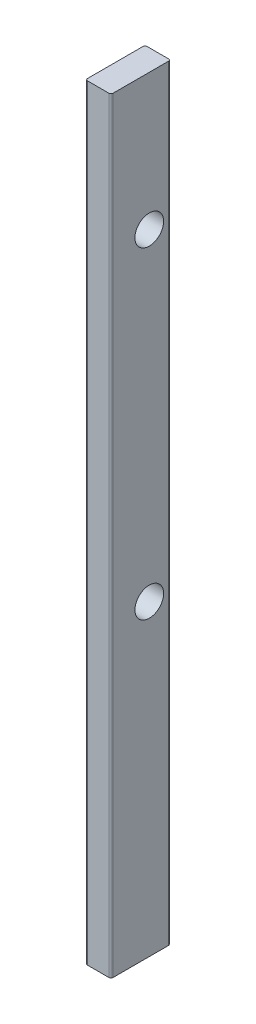
ISO-10303-21;
HEADER;
FILE_DESCRIPTION(('STEP AP214'),'2;1');
FILE_NAME('part.step','',(''),(''),'','','');
FILE_SCHEMA(('AUTOMOTIVE_DESIGN { 1 0 10303 214 1 1 1 1 }'));
ENDSEC;
DATA;
#1=APPLICATION_CONTEXT('core data for automotive mechanical design processes');
#2=APPLICATION_PROTOCOL_DEFINITION('international standard','automotive_design',2000,#1);
#3=PRODUCT_CONTEXT('',#1,'mechanical');
#4=PRODUCT('Part','Part','',(#3));
#5=PRODUCT_RELATED_PRODUCT_CATEGORY('part','',(#4));
#6=PRODUCT_DEFINITION_FORMATION('','',#4);
#7=PRODUCT_DEFINITION_CONTEXT('part definition',#1,'design');
#8=PRODUCT_DEFINITION('design','',#6,#7);
#9=PRODUCT_DEFINITION_SHAPE('','',#8);
#10=(LENGTH_UNIT() NAMED_UNIT(*) SI_UNIT(.MILLI.,.METRE.));
#11=(NAMED_UNIT(*) PLANE_ANGLE_UNIT() SI_UNIT($,.RADIAN.));
#12=(NAMED_UNIT(*) SI_UNIT($,.STERADIAN.) SOLID_ANGLE_UNIT());
#13=UNCERTAINTY_MEASURE_WITH_UNIT(LENGTH_MEASURE(1.E-05),#10,'distance_accuracy_value','');
#14=(GEOMETRIC_REPRESENTATION_CONTEXT(3) GLOBAL_UNCERTAINTY_ASSIGNED_CONTEXT((#13)) GLOBAL_UNIT_ASSIGNED_CONTEXT((#10,
#11,#12)) REPRESENTATION_CONTEXT('',''));
#15=CARTESIAN_POINT('',(0.,0.,0.));
#16=DIRECTION('',(0.,0.,1.));
#17=DIRECTION('',(1.,0.,0.));
#18=AXIS2_PLACEMENT_3D('',#15,#16,#17);
#19=CARTESIAN_POINT('',(19.05,1143.,44.45));
#20=DIRECTION('',(-1.,0.,0.));
#21=DIRECTION('',(0.,0.,1.));
#22=AXIS2_PLACEMENT_3D('',#19,#20,#21);
#23=PLANE('',#22);
#24=CARTESIAN_POINT('',(19.05,458.7875,-12.7));
#25=DIRECTION('',(1.,0.,0.));
#26=DIRECTION('',(0.,0.,-1.));
#27=AXIS2_PLACEMENT_3D('',#24,#25,#26);
#28=CIRCLE('',#27,21.43125);
#29=CARTESIAN_POINT('',(19.05,458.7875,8.73125));
#30=VERTEX_POINT('',#29);
#31=EDGE_CURVE('E125',#30,#30,#28,.T.);
#32=ORIENTED_EDGE('',*,*,#31,.F.);
#33=EDGE_LOOP('',(#32));
#34=FACE_BOUND('',#33,.T.);
#35=CARTESIAN_POINT('',(19.05,939.8,-12.7));
#36=DIRECTION('',(1.,0.,0.));
#37=DIRECTION('',(0.,0.,-1.));
#38=AXIS2_PLACEMENT_3D('',#35,#36,#37);
#39=CIRCLE('',#38,21.43125);
#40=CARTESIAN_POINT('',(19.05,939.8,8.73125));
#41=VERTEX_POINT('',#40);
#42=EDGE_CURVE('E181',#41,#41,#39,.T.);
#43=ORIENTED_EDGE('',*,*,#42,.F.);
#44=EDGE_LOOP('',(#43));
#45=FACE_BOUND('',#44,.T.);
#46=DIRECTION('',(0.,0.,-1.));
#47=VECTOR('',#46,1.);
#48=CARTESIAN_POINT('',(19.05,1143.,44.45));
#49=LINE('',#48,#47);
#50=CARTESIAN_POINT('',(19.05,1143.,41.275));
#51=VERTEX_POINT('',#50);
#52=CARTESIAN_POINT('',(19.05,1143.,-41.275));
#53=VERTEX_POINT('',#52);
#54=EDGE_CURVE('E118',#51,#53,#49,.T.);
#55=ORIENTED_EDGE('',*,*,#54,.F.);
#56=DIRECTION('',(0.,-1.,0.));
#57=VECTOR('',#56,1.);
#58=CARTESIAN_POINT('',(19.05,1143.,41.275));
#59=LINE('',#58,#57);
#60=CARTESIAN_POINT('',(19.05,0.,41.275));
#61=VERTEX_POINT('',#60);
#62=EDGE_CURVE('E103',#51,#61,#59,.T.);
#63=ORIENTED_EDGE('',*,*,#62,.T.);
#64=DIRECTION('',(0.,0.,-1.));
#65=VECTOR('',#64,1.);
#66=CARTESIAN_POINT('',(19.05,0.,44.45));
#67=LINE('',#66,#65);
#68=CARTESIAN_POINT('',(19.05,0.,-41.275));
#69=VERTEX_POINT('',#68);
#70=EDGE_CURVE('E115',#61,#69,#67,.T.);
#71=ORIENTED_EDGE('',*,*,#70,.T.);
#72=DIRECTION('',(0.,-1.,0.));
#73=VECTOR('',#72,1.);
#74=CARTESIAN_POINT('',(19.05,1143.,-41.275));
#75=LINE('',#74,#73);
#76=EDGE_CURVE('E120',#69,#53,#75,.F.);
#77=ORIENTED_EDGE('',*,*,#76,.T.);
#78=EDGE_LOOP('',(#55,#63,#71,#77));
#79=FACE_BOUND('',#78,.T.);
#80=ADVANCED_FACE('F33',(#34,#45,#79),#23,.F.);
#81=CARTESIAN_POINT('',(-19.05,1143.,-44.45));
#82=DIRECTION('',(0.,0.,1.));
#83=DIRECTION('',(1.,0.,0.));
#84=AXIS2_PLACEMENT_3D('',#81,#82,#83);
#85=PLANE('',#84);
#86=DIRECTION('',(-1.,0.,0.));
#87=VECTOR('',#86,1.);
#88=CARTESIAN_POINT('',(-19.05,0.,-44.45));
#89=LINE('',#88,#87);
#90=CARTESIAN_POINT('',(15.875,0.,-44.45));
#91=VERTEX_POINT('',#90);
#92=CARTESIAN_POINT('',(-15.875,0.,-44.45));
#93=VERTEX_POINT('',#92);
#94=EDGE_CURVE('E124',#91,#93,#89,.T.);
#95=ORIENTED_EDGE('',*,*,#94,.T.);
#96=DIRECTION('',(0.,-1.,0.));
#97=VECTOR('',#96,1.);
#98=CARTESIAN_POINT('',(-15.875,1143.,-44.45));
#99=LINE('',#98,#97);
#100=CARTESIAN_POINT('',(-15.875,1143.,-44.45));
#101=VERTEX_POINT('',#100);
#102=EDGE_CURVE('E11',#93,#101,#99,.F.);
#103=ORIENTED_EDGE('',*,*,#102,.T.);
#104=DIRECTION('',(-1.,0.,0.));
#105=VECTOR('',#104,1.);
#106=CARTESIAN_POINT('',(-19.05,1143.,-44.45));
#107=LINE('',#106,#105);
#108=CARTESIAN_POINT('',(15.875,1143.,-44.45));
#109=VERTEX_POINT('',#108);
#110=EDGE_CURVE('E164',#109,#101,#107,.T.);
#111=ORIENTED_EDGE('',*,*,#110,.F.);
#112=DIRECTION('',(0.,-1.,0.));
#113=VECTOR('',#112,1.);
#114=CARTESIAN_POINT('',(15.875,1143.,-44.45));
#115=LINE('',#114,#113);
#116=EDGE_CURVE('E41',#109,#91,#115,.T.);
#117=ORIENTED_EDGE('',*,*,#116,.T.);
#118=EDGE_LOOP('',(#95,#103,#111,#117));
#119=FACE_BOUND('',#118,.T.);
#120=ADVANCED_FACE('F162',(#119),#85,.F.);
#121=CARTESIAN_POINT('',(-19.05,1143.,44.45));
#122=DIRECTION('',(1.,0.,0.));
#123=DIRECTION('',(0.,0.,-1.));
#124=AXIS2_PLACEMENT_3D('',#121,#122,#123);
#125=PLANE('',#124);
#126=CARTESIAN_POINT('',(-19.05,458.7875,-12.7));
#127=DIRECTION('',(1.,0.,0.));
#128=DIRECTION('',(0.,0.,-1.));
#129=AXIS2_PLACEMENT_3D('',#126,#127,#128);
#130=CIRCLE('',#129,21.43125);
#131=CARTESIAN_POINT('',(-19.05,458.7875,8.73125));
#132=VERTEX_POINT('',#131);
#133=EDGE_CURVE('E131',#132,#132,#130,.T.);
#134=ORIENTED_EDGE('',*,*,#133,.T.);
#135=EDGE_LOOP('',(#134));
#136=FACE_BOUND('',#135,.T.);
#137=CARTESIAN_POINT('',(-19.05,939.8,-12.7));
#138=DIRECTION('',(1.,0.,0.));
#139=DIRECTION('',(0.,0.,-1.));
#140=AXIS2_PLACEMENT_3D('',#137,#138,#139);
#141=CIRCLE('',#140,21.43125);
#142=CARTESIAN_POINT('',(-19.05,939.8,8.73125));
#143=VERTEX_POINT('',#142);
#144=EDGE_CURVE('E178',#143,#143,#141,.T.);
#145=ORIENTED_EDGE('',*,*,#144,.T.);
#146=EDGE_LOOP('',(#145));
#147=FACE_BOUND('',#146,.T.);
#148=DIRECTION('',(0.,0.,1.));
#149=VECTOR('',#148,1.);
#150=CARTESIAN_POINT('',(-19.05,0.,44.45));
#151=LINE('',#150,#149);
#152=CARTESIAN_POINT('',(-19.05,0.,-41.275));
#153=VERTEX_POINT('',#152);
#154=CARTESIAN_POINT('',(-19.05,0.,41.275));
#155=VERTEX_POINT('',#154);
#156=EDGE_CURVE('E128',#153,#155,#151,.T.);
#157=ORIENTED_EDGE('',*,*,#156,.T.);
#158=DIRECTION('',(0.,-1.,0.));
#159=VECTOR('',#158,1.);
#160=CARTESIAN_POINT('',(-19.05,1143.,41.275));
#161=LINE('',#160,#159);
#162=CARTESIAN_POINT('',(-19.05,1143.,41.275));
#163=VERTEX_POINT('',#162);
#164=EDGE_CURVE('E48',#155,#163,#161,.F.);
#165=ORIENTED_EDGE('',*,*,#164,.T.);
#166=DIRECTION('',(0.,0.,1.));
#167=VECTOR('',#166,1.);
#168=CARTESIAN_POINT('',(-19.05,1143.,44.45));
#169=LINE('',#168,#167);
#170=CARTESIAN_POINT('',(-19.05,1143.,-41.275));
#171=VERTEX_POINT('',#170);
#172=EDGE_CURVE('E172',#171,#163,#169,.T.);
#173=ORIENTED_EDGE('',*,*,#172,.F.);
#174=DIRECTION('',(0.,-1.,0.));
#175=VECTOR('',#174,1.);
#176=CARTESIAN_POINT('',(-19.05,1143.,-41.275));
#177=LINE('',#176,#175);
#178=EDGE_CURVE('E155',#171,#153,#177,.T.);
#179=ORIENTED_EDGE('',*,*,#178,.T.);
#180=EDGE_LOOP('',(#157,#165,#173,#179));
#181=FACE_BOUND('',#180,.T.);
#182=ADVANCED_FACE('F171',(#136,#147,#181),#125,.F.);
#183=CARTESIAN_POINT('',(-19.05,1143.,44.45));
#184=DIRECTION('',(0.,0.,-1.));
#185=DIRECTION('',(-1.,0.,0.));
#186=AXIS2_PLACEMENT_3D('',#183,#184,#185);
#187=PLANE('',#186);
#188=DIRECTION('',(1.,0.,0.));
#189=VECTOR('',#188,1.);
#190=CARTESIAN_POINT('',(-19.05,0.,44.45));
#191=LINE('',#190,#189);
#192=CARTESIAN_POINT('',(-15.875,0.,44.45));
#193=VERTEX_POINT('',#192);
#194=CARTESIAN_POINT('',(15.875,0.,44.45));
#195=VERTEX_POINT('',#194);
#196=EDGE_CURVE('E138',#193,#195,#191,.T.);
#197=ORIENTED_EDGE('',*,*,#196,.T.);
#198=DIRECTION('',(0.,-1.,0.));
#199=VECTOR('',#198,1.);
#200=CARTESIAN_POINT('',(15.875,1143.,44.45));
#201=LINE('',#200,#199);
#202=CARTESIAN_POINT('',(15.875,1143.,44.45));
#203=VERTEX_POINT('',#202);
#204=EDGE_CURVE('E104',#195,#203,#201,.F.);
#205=ORIENTED_EDGE('',*,*,#204,.T.);
#206=DIRECTION('',(1.,0.,0.));
#207=VECTOR('',#206,1.);
#208=CARTESIAN_POINT('',(-19.05,1143.,44.45));
#209=LINE('',#208,#207);
#210=CARTESIAN_POINT('',(-15.875,1143.,44.45));
#211=VERTEX_POINT('',#210);
#212=EDGE_CURVE('E134',#211,#203,#209,.T.);
#213=ORIENTED_EDGE('',*,*,#212,.F.);
#214=DIRECTION('',(0.,-1.,0.));
#215=VECTOR('',#214,1.);
#216=CARTESIAN_POINT('',(-15.875,1143.,44.45));
#217=LINE('',#216,#215);
#218=EDGE_CURVE('E109',#211,#193,#217,.T.);
#219=ORIENTED_EDGE('',*,*,#218,.T.);
#220=EDGE_LOOP('',(#197,#205,#213,#219));
#221=FACE_BOUND('',#220,.T.);
#222=ADVANCED_FACE('F225',(#221),#187,.F.);
#223=CARTESIAN_POINT('',(0.,1143.,0.));
#224=DIRECTION('',(0.,-1.,0.));
#225=DIRECTION('',(0.,0.,-1.));
#226=AXIS2_PLACEMENT_3D('',#223,#224,#225);
#227=PLANE('',#226);
#228=ORIENTED_EDGE('',*,*,#212,.T.);
#229=CARTESIAN_POINT('',(15.875,1143.,41.275));
#230=DIRECTION('',(0.,-1.,0.));
#231=DIRECTION('',(0.,0.,-1.));
#232=AXIS2_PLACEMENT_3D('',#229,#230,#231);
#233=CIRCLE('',#232,3.175);
#234=EDGE_CURVE('E153',#203,#51,#233,.F.);
#235=ORIENTED_EDGE('',*,*,#234,.T.);
#236=ORIENTED_EDGE('',*,*,#54,.T.);
#237=CARTESIAN_POINT('',(15.875,1143.,-41.275));
#238=DIRECTION('',(0.,-1.,0.));
#239=DIRECTION('',(0.,0.,-1.));
#240=AXIS2_PLACEMENT_3D('',#237,#238,#239);
#241=CIRCLE('',#240,3.175);
#242=EDGE_CURVE('E148',#53,#109,#241,.F.);
#243=ORIENTED_EDGE('',*,*,#242,.T.);
#244=ORIENTED_EDGE('',*,*,#110,.T.);
#245=CARTESIAN_POINT('',(-15.875,1143.,-41.275));
#246=DIRECTION('',(0.,-1.,0.));
#247=DIRECTION('',(0.,0.,-1.));
#248=AXIS2_PLACEMENT_3D('',#245,#246,#247);
#249=CIRCLE('',#248,3.175);
#250=EDGE_CURVE('E55',#101,#171,#249,.F.);
#251=ORIENTED_EDGE('',*,*,#250,.T.);
#252=ORIENTED_EDGE('',*,*,#172,.T.);
#253=CARTESIAN_POINT('',(-15.875,1143.,41.275));
#254=DIRECTION('',(0.,-1.,0.));
#255=DIRECTION('',(0.,0.,-1.));
#256=AXIS2_PLACEMENT_3D('',#253,#254,#255);
#257=CIRCLE('',#256,3.175);
#258=EDGE_CURVE('E151',#163,#211,#257,.F.);
#259=ORIENTED_EDGE('',*,*,#258,.T.);
#260=EDGE_LOOP('',(#228,#235,#236,#243,#244,#251,#252,#259));
#261=FACE_BOUND('',#260,.T.);
#262=ADVANCED_FACE('F221',(#261),#227,.F.);
#263=CARTESIAN_POINT('',(0.,0.,0.));
#264=DIRECTION('',(0.,-1.,0.));
#265=DIRECTION('',(0.,0.,-1.));
#266=AXIS2_PLACEMENT_3D('',#263,#264,#265);
#267=PLANE('',#266);
#268=ORIENTED_EDGE('',*,*,#70,.F.);
#269=CARTESIAN_POINT('',(15.875,0.,41.275));
#270=DIRECTION('',(0.,-1.,0.));
#271=DIRECTION('',(0.,0.,-1.));
#272=AXIS2_PLACEMENT_3D('',#269,#270,#271);
#273=CIRCLE('',#272,3.175);
#274=EDGE_CURVE('E99',#61,#195,#273,.T.);
#275=ORIENTED_EDGE('',*,*,#274,.T.);
#276=ORIENTED_EDGE('',*,*,#196,.F.);
#277=CARTESIAN_POINT('',(-15.875,0.,41.275));
#278=DIRECTION('',(0.,-1.,0.));
#279=DIRECTION('',(0.,0.,-1.));
#280=AXIS2_PLACEMENT_3D('',#277,#278,#279);
#281=CIRCLE('',#280,3.175);
#282=EDGE_CURVE('E110',#193,#155,#281,.T.);
#283=ORIENTED_EDGE('',*,*,#282,.T.);
#284=ORIENTED_EDGE('',*,*,#156,.F.);
#285=CARTESIAN_POINT('',(-15.875,0.,-41.275));
#286=DIRECTION('',(0.,-1.,0.));
#287=DIRECTION('',(0.,0.,-1.));
#288=AXIS2_PLACEMENT_3D('',#285,#286,#287);
#289=CIRCLE('',#288,3.175);
#290=EDGE_CURVE('E142',#153,#93,#289,.T.);
#291=ORIENTED_EDGE('',*,*,#290,.T.);
#292=ORIENTED_EDGE('',*,*,#94,.F.);
#293=CARTESIAN_POINT('',(15.875,0.,-41.275));
#294=DIRECTION('',(0.,-1.,0.));
#295=DIRECTION('',(0.,0.,-1.));
#296=AXIS2_PLACEMENT_3D('',#293,#294,#295);
#297=CIRCLE('',#296,3.175);
#298=EDGE_CURVE('E119',#91,#69,#297,.T.);
#299=ORIENTED_EDGE('',*,*,#298,.T.);
#300=EDGE_LOOP('',(#268,#275,#276,#283,#284,#291,#292,#299));
#301=FACE_BOUND('',#300,.T.);
#302=ADVANCED_FACE('F122',(#301),#267,.T.);
#303=CARTESIAN_POINT('',(19.05,939.8,-12.7));
#304=DIRECTION('',(-1.,0.,0.));
#305=DIRECTION('',(0.,0.,1.));
#306=AXIS2_PLACEMENT_3D('',#303,#304,#305);
#307=CYLINDRICAL_SURFACE('',#306,21.43125);
#308=CARTESIAN_POINT('',(19.05,939.8,8.73125));
#309=CARTESIAN_POINT('',(18.653125,939.8,8.73125));
#310=CARTESIAN_POINT('',(18.25625,939.8,8.73125));
#311=CARTESIAN_POINT('',(17.4625,939.8,8.73125));
#312=CARTESIAN_POINT('',(17.065625,939.8,8.73125));
#313=CARTESIAN_POINT('',(16.271875,939.8,8.73125));
#314=CARTESIAN_POINT('',(15.875,939.8,8.73125));
#315=CARTESIAN_POINT('',(15.08125,939.8,8.73125));
#316=CARTESIAN_POINT('',(14.684375,939.8,8.73125));
#317=CARTESIAN_POINT('',(13.890625,939.8,8.73125));
#318=CARTESIAN_POINT('',(13.49375,939.8,8.73125));
#319=CARTESIAN_POINT('',(12.7,939.8,8.73125));
#320=CARTESIAN_POINT('',(12.303125,939.8,8.73125));
#321=CARTESIAN_POINT('',(11.509375,939.8,8.73125));
#322=CARTESIAN_POINT('',(11.1125,939.8,8.73125));
#323=CARTESIAN_POINT('',(10.31875,939.8,8.73125));
#324=CARTESIAN_POINT('',(9.921875,939.8,8.73125));
#325=CARTESIAN_POINT('',(9.128125,939.8,8.73125));
#326=CARTESIAN_POINT('',(8.73125,939.8,8.73125));
#327=CARTESIAN_POINT('',(7.9375,939.8,8.73125));
#328=CARTESIAN_POINT('',(7.540625,939.8,8.73125));
#329=CARTESIAN_POINT('',(6.746875,939.8,8.73125));
#330=CARTESIAN_POINT('',(6.35,939.8,8.73125));
#331=CARTESIAN_POINT('',(5.55625,939.8,8.73125));
#332=CARTESIAN_POINT('',(5.159375,939.8,8.73125));
#333=CARTESIAN_POINT('',(4.365625,939.8,8.73125));
#334=CARTESIAN_POINT('',(3.96875,939.8,8.73125));
#335=CARTESIAN_POINT('',(3.175,939.8,8.73125));
#336=CARTESIAN_POINT('',(2.778125,939.8,8.73125));
#337=CARTESIAN_POINT('',(1.984375,939.8,8.73125));
#338=CARTESIAN_POINT('',(1.5875,939.8,8.73125));
#339=CARTESIAN_POINT('',(0.793750000000004,939.8,8.73125));
#340=CARTESIAN_POINT('',(0.396875000000004,939.8,8.73125));
#341=CARTESIAN_POINT('',(-0.396874999999997,939.8,8.73125));
#342=CARTESIAN_POINT('',(-0.793749999999997,939.8,8.73125));
#343=CARTESIAN_POINT('',(-1.5875,939.8,8.73125));
#344=CARTESIAN_POINT('',(-1.984375,939.8,8.73125));
#345=CARTESIAN_POINT('',(-2.778125,939.8,8.73125));
#346=CARTESIAN_POINT('',(-3.175,939.8,8.73125));
#347=CARTESIAN_POINT('',(-3.96875,939.8,8.73125));
#348=CARTESIAN_POINT('',(-4.365625,939.8,8.73125));
#349=CARTESIAN_POINT('',(-5.159375,939.8,8.73125));
#350=CARTESIAN_POINT('',(-5.55625,939.8,8.73125));
#351=CARTESIAN_POINT('',(-6.35,939.8,8.73125));
#352=CARTESIAN_POINT('',(-6.746875,939.8,8.73125));
#353=CARTESIAN_POINT('',(-7.540625,939.8,8.73125));
#354=CARTESIAN_POINT('',(-7.9375,939.8,8.73125));
#355=CARTESIAN_POINT('',(-8.73125,939.8,8.73125));
#356=CARTESIAN_POINT('',(-9.128125,939.8,8.73125));
#357=CARTESIAN_POINT('',(-9.921875,939.8,8.73125));
#358=CARTESIAN_POINT('',(-10.31875,939.8,8.73125));
#359=CARTESIAN_POINT('',(-11.1125,939.8,8.73125));
#360=CARTESIAN_POINT('',(-11.509375,939.8,8.73125));
#361=CARTESIAN_POINT('',(-12.303125,939.8,8.73125));
#362=CARTESIAN_POINT('',(-12.7,939.8,8.73125));
#363=CARTESIAN_POINT('',(-13.49375,939.8,8.73125));
#364=CARTESIAN_POINT('',(-13.890625,939.8,8.73125));
#365=CARTESIAN_POINT('',(-14.684375,939.8,8.73125));
#366=CARTESIAN_POINT('',(-15.08125,939.8,8.73125));
#367=CARTESIAN_POINT('',(-15.875,939.8,8.73125));
#368=CARTESIAN_POINT('',(-16.271875,939.8,8.73125));
#369=CARTESIAN_POINT('',(-17.065625,939.8,8.73125));
#370=CARTESIAN_POINT('',(-17.4625,939.8,8.73125));
#371=CARTESIAN_POINT('',(-18.25625,939.8,8.73125));
#372=CARTESIAN_POINT('',(-18.653125,939.8,8.73125));
#373=CARTESIAN_POINT('',(-19.05,939.8,8.73125));
#374=B_SPLINE_CURVE_WITH_KNOTS('',3,(#308,#309,#310,#311,#312,#313,#314,#315,#316,#317,#318,
#319,#320,#321,#322,#323,#324,#325,#326,#327,#328,#329,#330,#331,#332,#333,#334,#335,#336,#337,
#338,#339,#340,#341,#342,#343,#344,#345,#346,#347,#348,#349,#350,#351,#352,#353,#354,#355,#356,
#357,#358,#359,#360,#361,#362,#363,#364,#365,#366,#367,#368,#369,#370,#371,#372,#373),
.UNSPECIFIED.,.F.,.F.,(4,2,2,2,2,2,2,2,2,2,2,2,2,2,2,2,2,2,2,2,2,2,2,2,2,2,2,2,2,2,2,2,4),(0.,
1.190625,2.38125,3.571875,4.7625,5.953125,7.14375,8.334375,9.525,10.715625,11.90625,13.096875,
14.2875,15.478125,16.66875,17.859375,19.05,20.240625,21.43125,22.621875,23.8125,25.003125,
26.19375,27.384375,28.575,29.765625,30.95625,32.146875,33.3375,34.528125,35.71875,36.909375,
38.1),.UNSPECIFIED.);
#375=EDGE_CURVE('BSEAM191',#41,#143,#374,.T.);
#376=ORIENTED_EDGE('',*,*,#42,.T.);
#377=ORIENTED_EDGE('',*,*,#144,.F.);
#378=ORIENTED_EDGE('',*,*,#375,.T.);
#379=ORIENTED_EDGE('',*,*,#375,.F.);
#380=EDGE_LOOP('',(#376,#378,#377,#379));
#381=FACE_BOUND('',#380,.T.);
#382=ADVANCED_FACE('F191',(#381),#307,.F.);
#383=CARTESIAN_POINT('',(19.05,458.7875,-12.7));
#384=DIRECTION('',(-1.,0.,0.));
#385=DIRECTION('',(0.,0.,1.));
#386=AXIS2_PLACEMENT_3D('',#383,#384,#385);
#387=CYLINDRICAL_SURFACE('',#386,21.43125);
#388=CARTESIAN_POINT('',(19.05,458.7875,8.73125));
#389=CARTESIAN_POINT('',(18.653125,458.7875,8.73125));
#390=CARTESIAN_POINT('',(18.25625,458.7875,8.73125));
#391=CARTESIAN_POINT('',(17.4625,458.7875,8.73125));
#392=CARTESIAN_POINT('',(17.065625,458.7875,8.73125));
#393=CARTESIAN_POINT('',(16.271875,458.7875,8.73125));
#394=CARTESIAN_POINT('',(15.875,458.7875,8.73125));
#395=CARTESIAN_POINT('',(15.08125,458.7875,8.73125));
#396=CARTESIAN_POINT('',(14.684375,458.7875,8.73125));
#397=CARTESIAN_POINT('',(13.890625,458.7875,8.73125));
#398=CARTESIAN_POINT('',(13.49375,458.7875,8.73125));
#399=CARTESIAN_POINT('',(12.7,458.7875,8.73125));
#400=CARTESIAN_POINT('',(12.303125,458.7875,8.73125));
#401=CARTESIAN_POINT('',(11.509375,458.7875,8.73125));
#402=CARTESIAN_POINT('',(11.1125,458.7875,8.73125));
#403=CARTESIAN_POINT('',(10.31875,458.7875,8.73125));
#404=CARTESIAN_POINT('',(9.921875,458.7875,8.73125));
#405=CARTESIAN_POINT('',(9.128125,458.7875,8.73125));
#406=CARTESIAN_POINT('',(8.73125,458.7875,8.73125));
#407=CARTESIAN_POINT('',(7.9375,458.7875,8.73125));
#408=CARTESIAN_POINT('',(7.540625,458.7875,8.73125));
#409=CARTESIAN_POINT('',(6.746875,458.7875,8.73125));
#410=CARTESIAN_POINT('',(6.35,458.7875,8.73125));
#411=CARTESIAN_POINT('',(5.55625,458.7875,8.73125));
#412=CARTESIAN_POINT('',(5.159375,458.7875,8.73125));
#413=CARTESIAN_POINT('',(4.365625,458.7875,8.73125));
#414=CARTESIAN_POINT('',(3.96875,458.7875,8.73125));
#415=CARTESIAN_POINT('',(3.175,458.7875,8.73125));
#416=CARTESIAN_POINT('',(2.778125,458.7875,8.73125));
#417=CARTESIAN_POINT('',(1.984375,458.7875,8.73125));
#418=CARTESIAN_POINT('',(1.5875,458.7875,8.73125));
#419=CARTESIAN_POINT('',(0.793750000000004,458.7875,8.73125));
#420=CARTESIAN_POINT('',(0.396875000000004,458.7875,8.73125));
#421=CARTESIAN_POINT('',(-0.396874999999997,458.7875,8.73125));
#422=CARTESIAN_POINT('',(-0.793749999999997,458.7875,8.73125));
#423=CARTESIAN_POINT('',(-1.5875,458.7875,8.73125));
#424=CARTESIAN_POINT('',(-1.984375,458.7875,8.73125));
#425=CARTESIAN_POINT('',(-2.778125,458.7875,8.73125));
#426=CARTESIAN_POINT('',(-3.175,458.7875,8.73125));
#427=CARTESIAN_POINT('',(-3.96875,458.7875,8.73125));
#428=CARTESIAN_POINT('',(-4.365625,458.7875,8.73125));
#429=CARTESIAN_POINT('',(-5.159375,458.7875,8.73125));
#430=CARTESIAN_POINT('',(-5.55625,458.7875,8.73125));
#431=CARTESIAN_POINT('',(-6.35,458.7875,8.73125));
#432=CARTESIAN_POINT('',(-6.746875,458.7875,8.73125));
#433=CARTESIAN_POINT('',(-7.540625,458.7875,8.73125));
#434=CARTESIAN_POINT('',(-7.9375,458.7875,8.73125));
#435=CARTESIAN_POINT('',(-8.73125,458.7875,8.73125));
#436=CARTESIAN_POINT('',(-9.128125,458.7875,8.73125));
#437=CARTESIAN_POINT('',(-9.921875,458.7875,8.73125));
#438=CARTESIAN_POINT('',(-10.31875,458.7875,8.73125));
#439=CARTESIAN_POINT('',(-11.1125,458.7875,8.73125));
#440=CARTESIAN_POINT('',(-11.509375,458.7875,8.73125));
#441=CARTESIAN_POINT('',(-12.303125,458.7875,8.73125));
#442=CARTESIAN_POINT('',(-12.7,458.7875,8.73125));
#443=CARTESIAN_POINT('',(-13.49375,458.7875,8.73125));
#444=CARTESIAN_POINT('',(-13.890625,458.7875,8.73125));
#445=CARTESIAN_POINT('',(-14.684375,458.7875,8.73125));
#446=CARTESIAN_POINT('',(-15.08125,458.7875,8.73125));
#447=CARTESIAN_POINT('',(-15.875,458.7875,8.73125));
#448=CARTESIAN_POINT('',(-16.271875,458.7875,8.73125));
#449=CARTESIAN_POINT('',(-17.065625,458.7875,8.73125));
#450=CARTESIAN_POINT('',(-17.4625,458.7875,8.73125));
#451=CARTESIAN_POINT('',(-18.25625,458.7875,8.73125));
#452=CARTESIAN_POINT('',(-18.653125,458.7875,8.73125));
#453=CARTESIAN_POINT('',(-19.05,458.7875,8.73125));
#454=B_SPLINE_CURVE_WITH_KNOTS('',3,(#388,#389,#390,#391,#392,#393,#394,#395,#396,#397,#398,
#399,#400,#401,#402,#403,#404,#405,#406,#407,#408,#409,#410,#411,#412,#413,#414,#415,#416,#417,
#418,#419,#420,#421,#422,#423,#424,#425,#426,#427,#428,#429,#430,#431,#432,#433,#434,#435,#436,
#437,#438,#439,#440,#441,#442,#443,#444,#445,#446,#447,#448,#449,#450,#451,#452,#453),
.UNSPECIFIED.,.F.,.F.,(4,2,2,2,2,2,2,2,2,2,2,2,2,2,2,2,2,2,2,2,2,2,2,2,2,2,2,2,2,2,2,2,4),(0.,
1.190625,2.38125,3.571875,4.7625,5.953125,7.14375,8.334375,9.525,10.715625,11.90625,13.096875,
14.2875,15.478125,16.66875,17.859375,19.05,20.240625,21.43125,22.621875,23.8125,25.003125,
26.19375,27.384375,28.575,29.765625,30.95625,32.146875,33.3375,34.528125,35.71875,36.909375,
38.1),.UNSPECIFIED.);
#455=EDGE_CURVE('BSEAM189',#30,#132,#454,.T.);
#456=ORIENTED_EDGE('',*,*,#31,.T.);
#457=ORIENTED_EDGE('',*,*,#133,.F.);
#458=ORIENTED_EDGE('',*,*,#455,.T.);
#459=ORIENTED_EDGE('',*,*,#455,.F.);
#460=EDGE_LOOP('',(#456,#458,#457,#459));
#461=FACE_BOUND('',#460,.T.);
#462=ADVANCED_FACE('F189',(#461),#387,.F.);
#463=CARTESIAN_POINT('',(15.875,1143.,41.275));
#464=DIRECTION('',(0.,-1.,0.));
#465=DIRECTION('',(0.,0.,-1.));
#466=AXIS2_PLACEMENT_3D('',#463,#464,#465);
#467=CYLINDRICAL_SURFACE('',#466,3.175);
#468=ORIENTED_EDGE('',*,*,#234,.F.);
#469=ORIENTED_EDGE('',*,*,#204,.F.);
#470=ORIENTED_EDGE('',*,*,#274,.F.);
#471=ORIENTED_EDGE('',*,*,#62,.F.);
#472=EDGE_LOOP('',(#468,#469,#470,#471));
#473=FACE_BOUND('',#472,.T.);
#474=ADVANCED_FACE('F102',(#473),#467,.T.);
#475=CARTESIAN_POINT('',(-15.875,1143.,41.275));
#476=DIRECTION('',(0.,-1.,0.));
#477=DIRECTION('',(0.,0.,-1.));
#478=AXIS2_PLACEMENT_3D('',#475,#476,#477);
#479=CYLINDRICAL_SURFACE('',#478,3.175);
#480=ORIENTED_EDGE('',*,*,#258,.F.);
#481=ORIENTED_EDGE('',*,*,#164,.F.);
#482=ORIENTED_EDGE('',*,*,#282,.F.);
#483=ORIENTED_EDGE('',*,*,#218,.F.);
#484=EDGE_LOOP('',(#480,#481,#482,#483));
#485=FACE_BOUND('',#484,.T.);
#486=ADVANCED_FACE('F198',(#485),#479,.T.);
#487=CARTESIAN_POINT('',(-15.875,1143.,-41.275));
#488=DIRECTION('',(0.,-1.,0.));
#489=DIRECTION('',(0.,0.,-1.));
#490=AXIS2_PLACEMENT_3D('',#487,#488,#489);
#491=CYLINDRICAL_SURFACE('',#490,3.175);
#492=ORIENTED_EDGE('',*,*,#250,.F.);
#493=ORIENTED_EDGE('',*,*,#102,.F.);
#494=ORIENTED_EDGE('',*,*,#290,.F.);
#495=ORIENTED_EDGE('',*,*,#178,.F.);
#496=EDGE_LOOP('',(#492,#493,#494,#495));
#497=FACE_BOUND('',#496,.T.);
#498=ADVANCED_FACE('F170',(#497),#491,.T.);
#499=CARTESIAN_POINT('',(15.875,1143.,-41.275));
#500=DIRECTION('',(0.,-1.,0.));
#501=DIRECTION('',(0.,0.,-1.));
#502=AXIS2_PLACEMENT_3D('',#499,#500,#501);
#503=CYLINDRICAL_SURFACE('',#502,3.175);
#504=ORIENTED_EDGE('',*,*,#242,.F.);
#505=ORIENTED_EDGE('',*,*,#76,.F.);
#506=ORIENTED_EDGE('',*,*,#298,.F.);
#507=ORIENTED_EDGE('',*,*,#116,.F.);
#508=EDGE_LOOP('',(#504,#505,#506,#507));
#509=FACE_BOUND('',#508,.T.);
#510=ADVANCED_FACE('F35',(#509),#503,.T.);
#511=CLOSED_SHELL('',(#80,#120,#182,#222,#262,#302,#382,#462,#474,#486,#498,#510));
#512=MANIFOLD_SOLID_BREP('B2',#511);
#513=ADVANCED_BREP_SHAPE_REPRESENTATION('',(#18,#512),#14);
#514=SHAPE_DEFINITION_REPRESENTATION(#9,#513);
ENDSEC;
END-ISO-10303-21;
